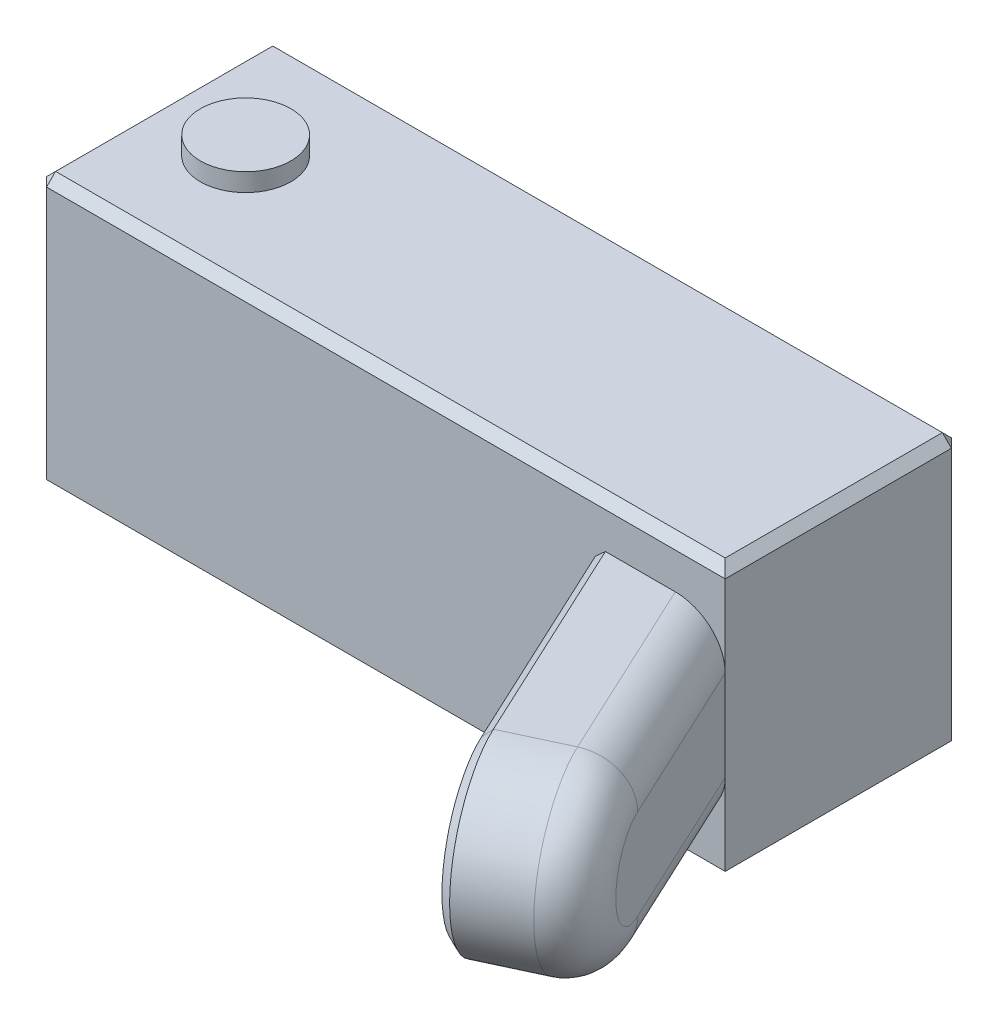
ISO-10303-21;
HEADER;
FILE_DESCRIPTION(('STEP AP214'),'2;1');
FILE_NAME('part.step','',(''),(''),'','','');
FILE_SCHEMA(('AUTOMOTIVE_DESIGN { 1 0 10303 214 1 1 1 1 }'));
ENDSEC;
DATA;
#1=APPLICATION_CONTEXT('core data for automotive mechanical design processes');
#2=APPLICATION_PROTOCOL_DEFINITION('international standard','automotive_design',2000,#1);
#3=PRODUCT_CONTEXT('',#1,'mechanical');
#4=PRODUCT('Part','Part','',(#3));
#5=PRODUCT_RELATED_PRODUCT_CATEGORY('part','',(#4));
#6=PRODUCT_DEFINITION_FORMATION('','',#4);
#7=PRODUCT_DEFINITION_CONTEXT('part definition',#1,'design');
#8=PRODUCT_DEFINITION('design','',#6,#7);
#9=PRODUCT_DEFINITION_SHAPE('','',#8);
#10=(LENGTH_UNIT() NAMED_UNIT(*) SI_UNIT(.MILLI.,.METRE.));
#11=(NAMED_UNIT(*) PLANE_ANGLE_UNIT() SI_UNIT($,.RADIAN.));
#12=(NAMED_UNIT(*) SI_UNIT($,.STERADIAN.) SOLID_ANGLE_UNIT());
#13=UNCERTAINTY_MEASURE_WITH_UNIT(LENGTH_MEASURE(1.E-05),#10,'distance_accuracy_value','');
#14=(GEOMETRIC_REPRESENTATION_CONTEXT(3) GLOBAL_UNCERTAINTY_ASSIGNED_CONTEXT((#13)) GLOBAL_UNIT_ASSIGNED_CONTEXT((#10,
#11,#12)) REPRESENTATION_CONTEXT('',''));
#15=CARTESIAN_POINT('',(0.,0.,0.));
#16=DIRECTION('',(0.,0.,1.));
#17=DIRECTION('',(1.,0.,0.));
#18=AXIS2_PLACEMENT_3D('',#15,#16,#17);
#19=CARTESIAN_POINT('',(38.,-15.,-13.));
#20=DIRECTION('',(1.,0.,0.));
#21=DIRECTION('',(0.,0.,-1.));
#22=AXIS2_PLACEMENT_3D('',#19,#20,#21);
#23=PLANE('',#22);
#24=DIRECTION('',(0.,1.,0.));
#25=VECTOR('',#24,1.);
#26=CARTESIAN_POINT('',(38.,-15.,13.));
#27=LINE('',#26,#25);
#28=CARTESIAN_POINT('',(38.,-14.,13.));
#29=VERTEX_POINT('',#28);
#30=CARTESIAN_POINT('',(38.,-5.,13.));
#31=VERTEX_POINT('',#30);
#32=EDGE_CURVE('E185',#29,#31,#27,.T.);
#33=ORIENTED_EDGE('',*,*,#32,.F.);
#34=DIRECTION('',(0.,0.,-1.));
#35=VECTOR('',#34,1.);
#36=CARTESIAN_POINT('',(38.,-14.,-13.));
#37=LINE('',#36,#35);
#38=CARTESIAN_POINT('',(38.,-14.,-12.));
#39=VERTEX_POINT('',#38);
#40=EDGE_CURVE('E260',#29,#39,#37,.T.);
#41=ORIENTED_EDGE('',*,*,#40,.T.);
#42=DIRECTION('',(0.,1.,0.));
#43=VECTOR('',#42,1.);
#44=CARTESIAN_POINT('',(38.,-15.,-12.));
#45=LINE('',#44,#43);
#46=CARTESIAN_POINT('',(38.,14.,-12.));
#47=VERTEX_POINT('',#46);
#48=EDGE_CURVE('E256',#39,#47,#45,.T.);
#49=ORIENTED_EDGE('',*,*,#48,.T.);
#50=DIRECTION('',(0.,0.,1.));
#51=VECTOR('',#50,1.);
#52=CARTESIAN_POINT('',(38.,14.,-13.));
#53=LINE('',#52,#51);
#54=CARTESIAN_POINT('',(38.,14.,13.));
#55=VERTEX_POINT('',#54);
#56=EDGE_CURVE('E258',#47,#55,#53,.T.);
#57=ORIENTED_EDGE('',*,*,#56,.T.);
#58=CARTESIAN_POINT('',(38.,5.,13.));
#59=VERTEX_POINT('',#58);
#60=EDGE_CURVE('E201',#59,#55,#27,.T.);
#61=ORIENTED_EDGE('',*,*,#60,.F.);
#62=DIRECTION('',(0.,-1.,0.));
#63=VECTOR('',#62,1.);
#64=CARTESIAN_POINT('',(38.,10.,13.));
#65=LINE('',#64,#63);
#66=EDGE_CURVE('E682',#59,#31,#65,.T.);
#67=ORIENTED_EDGE('',*,*,#66,.T.);
#68=EDGE_LOOP('',(#33,#41,#49,#57,#61,#67));
#69=FACE_BOUND('',#68,.T.);
#70=ADVANCED_FACE('F35',(#69),#23,.T.);
#71=CARTESIAN_POINT('',(-38.,-15.,13.));
#72=DIRECTION('',(0.,0.,1.));
#73=DIRECTION('',(1.,0.,0.));
#74=AXIS2_PLACEMENT_3D('',#71,#72,#73);
#75=PLANE('',#74);
#76=DIRECTION('',(0.,-1.,0.));
#77=VECTOR('',#76,1.);
#78=CARTESIAN_POINT('',(-37.,-15.,13.));
#79=LINE('',#78,#77);
#80=CARTESIAN_POINT('',(-37.,14.,13.));
#81=VERTEX_POINT('',#80);
#82=CARTESIAN_POINT('',(-37.,-14.,13.));
#83=VERTEX_POINT('',#82);
#84=EDGE_CURVE('E252',#81,#83,#79,.T.);
#85=ORIENTED_EDGE('',*,*,#84,.T.);
#86=DIRECTION('',(1.,0.,0.));
#87=VECTOR('',#86,1.);
#88=CARTESIAN_POINT('',(38.,-14.,13.));
#89=LINE('',#88,#87);
#90=EDGE_CURVE('E254',#83,#29,#89,.T.);
#91=ORIENTED_EDGE('',*,*,#90,.T.);
#92=ORIENTED_EDGE('',*,*,#32,.T.);
#93=CARTESIAN_POINT('',(32.4831104051875,-5.,13.));
#94=DIRECTION('',(0.,0.,1.));
#95=DIRECTION('',(1.,0.,0.));
#96=AXIS2_PLACEMENT_3D('',#93,#94,#95);
#97=ELLIPSE('',#96,5.51688959481247,5.);
#98=CARTESIAN_POINT('',(32.4831104051875,-10.,13.));
#99=VERTEX_POINT('',#98);
#100=EDGE_CURVE('E181',#31,#99,#97,.F.);
#101=ORIENTED_EDGE('',*,*,#100,.T.);
#102=DIRECTION('',(1.,0.,0.));
#103=VECTOR('',#102,1.);
#104=CARTESIAN_POINT('',(14.466506171018,-10.,13.));
#105=LINE('',#104,#103);
#106=CARTESIAN_POINT('',(24.7594649724501,-10.,13.));
#107=VERTEX_POINT('',#106);
#108=EDGE_CURVE('E167',#107,#99,#105,.T.);
#109=ORIENTED_EDGE('',*,*,#108,.F.);
#110=DIRECTION('',(0.74096564527329,-0.671542934237817,0.));
#111=VECTOR('',#110,1.);
#112=CARTESIAN_POINT('',(12.1420574909731,1.43525465267701,13.));
#113=LINE('',#112,#111);
#114=CARTESIAN_POINT('',(23.6560870534876,-9.,13.));
#115=VERTEX_POINT('',#114);
#116=EDGE_CURVE('E45',#107,#115,#113,.F.);
#117=ORIENTED_EDGE('',*,*,#116,.T.);
#118=DIRECTION('',(0.,-1.,0.));
#119=VECTOR('',#118,1.);
#120=CARTESIAN_POINT('',(23.6560870534876,-10.,13.));
#121=LINE('',#120,#119);
#122=CARTESIAN_POINT('',(23.6560870534876,9.,13.));
#123=VERTEX_POINT('',#122);
#124=EDGE_CURVE('E177',#123,#115,#121,.T.);
#125=ORIENTED_EDGE('',*,*,#124,.F.);
#126=DIRECTION('',(-0.74096564527329,-0.671542934237817,0.));
#127=VECTOR('',#126,1.);
#128=CARTESIAN_POINT('',(13.1372379781656,-0.533314827627534,13.));
#129=LINE('',#128,#127);
#130=CARTESIAN_POINT('',(24.7594649724501,10.,13.));
#131=VERTEX_POINT('',#130);
#132=EDGE_CURVE('E11',#123,#131,#129,.F.);
#133=ORIENTED_EDGE('',*,*,#132,.T.);
#134=DIRECTION('',(-1.,0.,0.));
#135=VECTOR('',#134,1.);
#136=CARTESIAN_POINT('',(2.68450493954154,10.,13.));
#137=LINE('',#136,#135);
#138=CARTESIAN_POINT('',(32.4831104051875,10.,13.));
#139=VERTEX_POINT('',#138);
#140=EDGE_CURVE('E178',#139,#131,#137,.T.);
#141=ORIENTED_EDGE('',*,*,#140,.F.);
#142=CARTESIAN_POINT('',(32.4831104051875,5.,13.));
#143=DIRECTION('',(0.,0.,1.));
#144=DIRECTION('',(-1.,0.,0.));
#145=AXIS2_PLACEMENT_3D('',#142,#143,#144);
#146=ELLIPSE('',#145,5.51688959481247,5.);
#147=EDGE_CURVE('E189',#139,#59,#146,.F.);
#148=ORIENTED_EDGE('',*,*,#147,.T.);
#149=ORIENTED_EDGE('',*,*,#60,.T.);
#150=DIRECTION('',(-1.,0.,0.));
#151=VECTOR('',#150,1.);
#152=CARTESIAN_POINT('',(-38.,14.,13.));
#153=LINE('',#152,#151);
#154=EDGE_CURVE('E250',#55,#81,#153,.T.);
#155=ORIENTED_EDGE('',*,*,#154,.T.);
#156=EDGE_LOOP('',(#85,#91,#92,#101,#109,#117,#125,#133,#141,#148,#149,#155));
#157=FACE_BOUND('',#156,.T.);
#158=ADVANCED_FACE('F182',(#157),#75,.T.);
#159=CARTESIAN_POINT('',(-38.,-15.,-13.));
#160=DIRECTION('',(-1.,0.,0.));
#161=DIRECTION('',(0.,0.,1.));
#162=AXIS2_PLACEMENT_3D('',#159,#160,#161);
#163=PLANE('',#162);
#164=DIRECTION('',(0.,-1.,0.));
#165=VECTOR('',#164,1.);
#166=CARTESIAN_POINT('',(-38.,-15.,-12.));
#167=LINE('',#166,#165);
#168=CARTESIAN_POINT('',(-38.,14.,-12.));
#169=VERTEX_POINT('',#168);
#170=CARTESIAN_POINT('',(-38.,-14.,-12.));
#171=VERTEX_POINT('',#170);
#172=EDGE_CURVE('E266',#169,#171,#167,.T.);
#173=ORIENTED_EDGE('',*,*,#172,.T.);
#174=DIRECTION('',(0.,0.,1.));
#175=VECTOR('',#174,1.);
#176=CARTESIAN_POINT('',(-38.,-14.,13.));
#177=LINE('',#176,#175);
#178=CARTESIAN_POINT('',(-38.,-14.,12.));
#179=VERTEX_POINT('',#178);
#180=EDGE_CURVE('E268',#171,#179,#177,.T.);
#181=ORIENTED_EDGE('',*,*,#180,.T.);
#182=DIRECTION('',(0.,1.,0.));
#183=VECTOR('',#182,1.);
#184=CARTESIAN_POINT('',(-38.,-15.,12.));
#185=LINE('',#184,#183);
#186=CARTESIAN_POINT('',(-38.,14.,12.));
#187=VERTEX_POINT('',#186);
#188=EDGE_CURVE('E264',#179,#187,#185,.T.);
#189=ORIENTED_EDGE('',*,*,#188,.T.);
#190=DIRECTION('',(0.,0.,-1.));
#191=VECTOR('',#190,1.);
#192=CARTESIAN_POINT('',(-38.,14.,-13.));
#193=LINE('',#192,#191);
#194=EDGE_CURVE('E262',#187,#169,#193,.T.);
#195=ORIENTED_EDGE('',*,*,#194,.T.);
#196=EDGE_LOOP('',(#173,#181,#189,#195));
#197=FACE_BOUND('',#196,.T.);
#198=ADVANCED_FACE('F354',(#197),#163,.T.);
#199=CARTESIAN_POINT('',(-38.,-15.,-13.));
#200=DIRECTION('',(0.,0.,-1.));
#201=DIRECTION('',(-1.,0.,0.));
#202=AXIS2_PLACEMENT_3D('',#199,#200,#201);
#203=PLANE('',#202);
#204=DIRECTION('',(0.,-1.,0.));
#205=VECTOR('',#204,1.);
#206=CARTESIAN_POINT('',(37.,-15.,-13.));
#207=LINE('',#206,#205);
#208=CARTESIAN_POINT('',(37.,14.,-13.));
#209=VERTEX_POINT('',#208);
#210=CARTESIAN_POINT('',(37.,-14.,-13.));
#211=VERTEX_POINT('',#210);
#212=EDGE_CURVE('E232',#209,#211,#207,.T.);
#213=ORIENTED_EDGE('',*,*,#212,.T.);
#214=DIRECTION('',(-1.,0.,0.));
#215=VECTOR('',#214,1.);
#216=CARTESIAN_POINT('',(-38.,-14.,-13.));
#217=LINE('',#216,#215);
#218=CARTESIAN_POINT('',(-37.,-14.,-13.));
#219=VERTEX_POINT('',#218);
#220=EDGE_CURVE('E238',#211,#219,#217,.T.);
#221=ORIENTED_EDGE('',*,*,#220,.T.);
#222=DIRECTION('',(0.,1.,0.));
#223=VECTOR('',#222,1.);
#224=CARTESIAN_POINT('',(-37.,-15.,-13.));
#225=LINE('',#224,#223);
#226=CARTESIAN_POINT('',(-37.,14.,-13.));
#227=VERTEX_POINT('',#226);
#228=EDGE_CURVE('E236',#219,#227,#225,.T.);
#229=ORIENTED_EDGE('',*,*,#228,.T.);
#230=DIRECTION('',(1.,0.,0.));
#231=VECTOR('',#230,1.);
#232=CARTESIAN_POINT('',(-38.,14.,-13.));
#233=LINE('',#232,#231);
#234=EDGE_CURVE('E234',#227,#209,#233,.T.);
#235=ORIENTED_EDGE('',*,*,#234,.T.);
#236=EDGE_LOOP('',(#213,#221,#229,#235));
#237=FACE_BOUND('',#236,.T.);
#238=ADVANCED_FACE('F415',(#237),#203,.T.);
#239=CARTESIAN_POINT('',(0.,-15.,0.));
#240=DIRECTION('',(0.,1.,0.));
#241=DIRECTION('',(0.,0.,1.));
#242=AXIS2_PLACEMENT_3D('',#239,#240,#241);
#243=PLANE('',#242);
#244=DIRECTION('',(1.,0.,0.));
#245=VECTOR('',#244,1.);
#246=CARTESIAN_POINT('',(38.,-15.,-12.));
#247=LINE('',#246,#245);
#248=CARTESIAN_POINT('',(-37.,-15.,-12.));
#249=VERTEX_POINT('',#248);
#250=CARTESIAN_POINT('',(37.,-15.,-12.));
#251=VERTEX_POINT('',#250);
#252=EDGE_CURVE('E245',#249,#251,#247,.T.);
#253=ORIENTED_EDGE('',*,*,#252,.T.);
#254=DIRECTION('',(0.,0.,1.));
#255=VECTOR('',#254,1.);
#256=CARTESIAN_POINT('',(37.,-15.,13.));
#257=LINE('',#256,#255);
#258=CARTESIAN_POINT('',(37.,-15.,12.));
#259=VERTEX_POINT('',#258);
#260=EDGE_CURVE('E248',#251,#259,#257,.T.);
#261=ORIENTED_EDGE('',*,*,#260,.T.);
#262=DIRECTION('',(-1.,0.,0.));
#263=VECTOR('',#262,1.);
#264=CARTESIAN_POINT('',(-38.,-15.,12.));
#265=LINE('',#264,#263);
#266=CARTESIAN_POINT('',(-37.,-15.,12.));
#267=VERTEX_POINT('',#266);
#268=EDGE_CURVE('E243',#259,#267,#265,.T.);
#269=ORIENTED_EDGE('',*,*,#268,.T.);
#270=DIRECTION('',(0.,0.,-1.));
#271=VECTOR('',#270,1.);
#272=CARTESIAN_POINT('',(-37.,-15.,-13.));
#273=LINE('',#272,#271);
#274=EDGE_CURVE('E241',#267,#249,#273,.T.);
#275=ORIENTED_EDGE('',*,*,#274,.T.);
#276=EDGE_LOOP('',(#253,#261,#269,#275));
#277=FACE_BOUND('',#276,.T.);
#278=ADVANCED_FACE('F413',(#277),#243,.F.);
#279=CARTESIAN_POINT('',(0.,15.,0.));
#280=DIRECTION('',(0.,1.,0.));
#281=DIRECTION('',(0.,0.,1.));
#282=AXIS2_PLACEMENT_3D('',#279,#280,#281);
#283=PLANE('',#282);
#284=CARTESIAN_POINT('',(-28.,15.,0.));
#285=DIRECTION('',(0.,1.,0.));
#286=DIRECTION('',(0.,0.,1.));
#287=AXIS2_PLACEMENT_3D('',#284,#285,#286);
#288=CIRCLE('',#287,5.);
#289=CARTESIAN_POINT('',(-28.,15.,5.));
#290=VERTEX_POINT('',#289);
#291=EDGE_CURVE('E674',#290,#290,#288,.T.);
#292=ORIENTED_EDGE('',*,*,#291,.F.);
#293=EDGE_LOOP('',(#292));
#294=FACE_BOUND('',#293,.T.);
#295=DIRECTION('',(0.,0.,1.));
#296=VECTOR('',#295,1.);
#297=CARTESIAN_POINT('',(-37.,15.,0.));
#298=LINE('',#297,#296);
#299=CARTESIAN_POINT('',(-37.,15.,-12.));
#300=VERTEX_POINT('',#299);
#301=CARTESIAN_POINT('',(-37.,15.,12.));
#302=VERTEX_POINT('',#301);
#303=EDGE_CURVE('E53',#300,#302,#298,.T.);
#304=ORIENTED_EDGE('',*,*,#303,.T.);
#305=DIRECTION('',(1.,0.,0.));
#306=VECTOR('',#305,1.);
#307=CARTESIAN_POINT('',(0.,15.,12.));
#308=LINE('',#307,#306);
#309=CARTESIAN_POINT('',(37.,15.,12.));
#310=VERTEX_POINT('',#309);
#311=EDGE_CURVE('E275',#302,#310,#308,.T.);
#312=ORIENTED_EDGE('',*,*,#311,.T.);
#313=DIRECTION('',(0.,0.,-1.));
#314=VECTOR('',#313,1.);
#315=CARTESIAN_POINT('',(37.,15.,0.));
#316=LINE('',#315,#314);
#317=CARTESIAN_POINT('',(37.,15.,-12.));
#318=VERTEX_POINT('',#317);
#319=EDGE_CURVE('E271',#310,#318,#316,.T.);
#320=ORIENTED_EDGE('',*,*,#319,.T.);
#321=DIRECTION('',(-1.,0.,0.));
#322=VECTOR('',#321,1.);
#323=CARTESIAN_POINT('',(0.,15.,-12.));
#324=LINE('',#323,#322);
#325=EDGE_CURVE('E58',#318,#300,#324,.T.);
#326=ORIENTED_EDGE('',*,*,#325,.T.);
#327=EDGE_LOOP('',(#304,#312,#320,#326));
#328=FACE_BOUND('',#327,.T.);
#329=ADVANCED_FACE('F391',(#294,#328),#283,.T.);
#330=CARTESIAN_POINT('',(14.466506171018,-10.,-37.4677403800204));
#331=DIRECTION('',(0.,1.,0.));
#332=DIRECTION('',(0.,0.,1.));
#333=AXIS2_PLACEMENT_3D('',#330,#331,#332);
#334=PLANE('',#333);
#335=DIRECTION('',(0.906307787036648,0.,-0.422618261740703));
#336=VECTOR('',#335,1.);
#337=CARTESIAN_POINT('',(34.6703640033377,-10.0000000000001,36.6201931433622));
#338=LINE('',#337,#336);
#339=CARTESIAN_POINT('',(35.5766717903743,-10.0000000000001,36.1975748816215));
#340=VERTEX_POINT('',#339);
#341=CARTESIAN_POINT('',(41.9208262996309,-10.0000000000001,33.2392470494366));
#342=VERTEX_POINT('',#341);
#343=EDGE_CURVE('E680',#340,#342,#338,.T.);
#344=ORIENTED_EDGE('',*,*,#343,.F.);
#345=DIRECTION('',(-0.422618261740703,0.,-0.906307787036648));
#346=VECTOR('',#345,1.);
#347=CARTESIAN_POINT('',(3.5908127265782,-10.,-32.3963212391319));
#348=LINE('',#347,#346);
#349=EDGE_CURVE('E174',#340,#107,#348,.T.);
#350=ORIENTED_EDGE('',*,*,#349,.T.);
#351=ORIENTED_EDGE('',*,*,#108,.T.);
#352=DIRECTION('',(0.422618261740703,0.,0.906307787036648));
#353=VECTOR('',#352,1.);
#354=CARTESIAN_POINT('',(9.93496723583475,-10.,-35.3546490713169));
#355=LINE('',#354,#353);
#356=EDGE_CURVE('E172',#99,#342,#355,.T.);
#357=ORIENTED_EDGE('',*,*,#356,.T.);
#358=EDGE_LOOP('',(#344,#350,#351,#357));
#359=FACE_BOUND('',#358,.T.);
#360=ADVANCED_FACE('F170',(#359),#334,.F.);
#361=CARTESIAN_POINT('',(2.68450493954154,-10.,-31.9737029773912));
#362=DIRECTION('',(0.906307787036648,0.,-0.422618261740703));
#363=DIRECTION('',(-0.422618261740703,0.,-0.906307787036648));
#364=AXIS2_PLACEMENT_3D('',#361,#362,#363);
#365=PLANE('',#364);
#366=ORIENTED_EDGE('',*,*,#124,.T.);
#367=DIRECTION('',(0.422618261740703,0.,0.906307787036648));
#368=VECTOR('',#367,1.);
#369=CARTESIAN_POINT('',(2.68450493954154,-9.,-31.9737029773912));
#370=LINE('',#369,#368);
#371=CARTESIAN_POINT('',(34.6703640033377,-9.00000000000012,36.6201931433622));
#372=VERTEX_POINT('',#371);
#373=EDGE_CURVE('E224',#115,#372,#370,.T.);
#374=ORIENTED_EDGE('',*,*,#373,.T.);
#375=CARTESIAN_POINT('',(34.6703640033377,-1.17306473400783E-13,36.6201931433622));
#376=DIRECTION('',(0.906307787036648,0.,-0.422618261740703));
#377=DIRECTION('',(-0.422618261740703,0.,-0.906307787036648));
#378=AXIS2_PLACEMENT_3D('',#375,#376,#377);
#379=CIRCLE('',#378,9.);
#380=CARTESIAN_POINT('',(34.6703640033377,9.,36.6201931433622));
#381=VERTEX_POINT('',#380);
#382=EDGE_CURVE('E222',#372,#381,#379,.F.);
#383=ORIENTED_EDGE('',*,*,#382,.T.);
#384=DIRECTION('',(-0.422618261740703,0.,-0.906307787036648));
#385=VECTOR('',#384,1.);
#386=CARTESIAN_POINT('',(2.68450493954154,9.,-31.9737029773912));
#387=LINE('',#386,#385);
#388=EDGE_CURVE('E214',#381,#123,#387,.T.);
#389=ORIENTED_EDGE('',*,*,#388,.T.);
#390=EDGE_LOOP('',(#366,#374,#383,#389));
#391=FACE_BOUND('',#390,.T.);
#392=ADVANCED_FACE('F600',(#391),#365,.F.);
#393=CARTESIAN_POINT('',(2.68450493954154,10.,-31.9737029773912));
#394=DIRECTION('',(0.,-1.,0.));
#395=DIRECTION('',(0.,0.,-1.));
#396=AXIS2_PLACEMENT_3D('',#393,#394,#395);
#397=PLANE('',#396);
#398=ORIENTED_EDGE('',*,*,#140,.T.);
#399=DIRECTION('',(0.422618261740703,0.,0.906307787036648));
#400=VECTOR('',#399,1.);
#401=CARTESIAN_POINT('',(3.59081272657819,10.,-32.3963212391319));
#402=LINE('',#401,#400);
#403=CARTESIAN_POINT('',(35.5766717903743,10.,36.1975748816215));
#404=VERTEX_POINT('',#403);
#405=EDGE_CURVE('E230',#131,#404,#402,.T.);
#406=ORIENTED_EDGE('',*,*,#405,.T.);
#407=DIRECTION('',(0.906307787036648,0.,-0.422618261740703));
#408=VECTOR('',#407,1.);
#409=CARTESIAN_POINT('',(34.6703640033377,10.,36.6201931433622));
#410=LINE('',#409,#408);
#411=CARTESIAN_POINT('',(41.9208262996309,10.,33.2392470494366));
#412=VERTEX_POINT('',#411);
#413=EDGE_CURVE('E220',#404,#412,#410,.T.);
#414=ORIENTED_EDGE('',*,*,#413,.T.);
#415=DIRECTION('',(-0.422618261740703,0.,-0.906307787036648));
#416=VECTOR('',#415,1.);
#417=CARTESIAN_POINT('',(9.93496723583475,10.,-35.3546490713169));
#418=LINE('',#417,#416);
#419=EDGE_CURVE('E208',#412,#139,#418,.T.);
#420=ORIENTED_EDGE('',*,*,#419,.T.);
#421=EDGE_LOOP('',(#398,#406,#414,#420));
#422=FACE_BOUND('',#421,.T.);
#423=ADVANCED_FACE('F424',(#422),#397,.F.);
#424=CARTESIAN_POINT('',(34.6703640033377,-1.17306473400783E-13,36.6201931433622));
#425=DIRECTION('',(0.906307787036648,0.,-0.422618261740703));
#426=DIRECTION('',(-0.422618261740703,0.,-0.906307787036648));
#427=AXIS2_PLACEMENT_3D('',#424,#425,#426);
#428=CYLINDRICAL_SURFACE('',#427,10.);
#429=ORIENTED_EDGE('',*,*,#413,.F.);
#430=CARTESIAN_POINT('',(35.5766717903743,-1.17306473400783E-13,36.1975748816215));
#431=DIRECTION('',(0.906307787036648,0.,-0.422618261740703));
#432=DIRECTION('',(-0.422618261740703,0.,-0.906307787036648));
#433=AXIS2_PLACEMENT_3D('',#430,#431,#432);
#434=CIRCLE('',#433,10.);
#435=EDGE_CURVE('E228',#404,#340,#434,.T.);
#436=ORIENTED_EDGE('',*,*,#435,.T.);
#437=ORIENTED_EDGE('',*,*,#343,.T.);
#438=CARTESIAN_POINT('',(41.9208262996309,-1.17306473400783E-13,33.2392470494366));
#439=DIRECTION('',(-0.906307787036648,0.,0.422618261740703));
#440=DIRECTION('',(0.422618261740703,0.,0.906307787036648));
#441=AXIS2_PLACEMENT_3D('',#438,#439,#440);
#442=CIRCLE('',#441,10.);
#443=EDGE_CURVE('E190',#342,#412,#442,.T.);
#444=ORIENTED_EDGE('',*,*,#443,.T.);
#445=EDGE_LOOP('',(#429,#436,#437,#444));
#446=FACE_BOUND('',#445,.T.);
#447=ADVANCED_FACE('F586',(#446),#428,.T.);
#448=CARTESIAN_POINT('',(46.4523652348141,-1.17306473400783E-13,31.1261557407331));
#449=DIRECTION('',(-0.906307787036648,0.,0.422618261740703));
#450=DIRECTION('',(0.422618261740703,0.,0.906307787036648));
#451=AXIS2_PLACEMENT_3D('',#448,#449,#450);
#452=PLANE('',#451);
#453=CARTESIAN_POINT('',(46.4523652348141,-1.17306473400783E-13,31.1261557407331));
#454=DIRECTION('',(-0.906307787036648,0.,0.422618261740703));
#455=DIRECTION('',(0.422618261740703,0.,0.906307787036648));
#456=AXIS2_PLACEMENT_3D('',#453,#454,#455);
#457=CIRCLE('',#456,5.);
#458=CARTESIAN_POINT('',(46.4523652348141,4.99999999999988,31.1261557407331));
#459=VERTEX_POINT('',#458);
#460=CARTESIAN_POINT('',(46.4523652348141,-5.00000000000012,31.1261557407331));
#461=VERTEX_POINT('',#460);
#462=EDGE_CURVE('E197',#459,#461,#457,.F.);
#463=ORIENTED_EDGE('',*,*,#462,.T.);
#464=DIRECTION('',(0.422618261740703,0.,0.906307787036648));
#465=VECTOR('',#464,1.);
#466=CARTESIAN_POINT('',(46.4523652348141,-5.,31.1261557407331));
#467=LINE('',#466,#465);
#468=EDGE_CURVE('E206',#461,#31,#467,.F.);
#469=ORIENTED_EDGE('',*,*,#468,.T.);
#470=ORIENTED_EDGE('',*,*,#66,.F.);
#471=DIRECTION('',(-0.422618261740703,0.,-0.906307787036648));
#472=VECTOR('',#471,1.);
#473=CARTESIAN_POINT('',(46.4523652348141,5.,31.1261557407331));
#474=LINE('',#473,#472);
#475=EDGE_CURVE('E199',#59,#459,#474,.F.);
#476=ORIENTED_EDGE('',*,*,#475,.T.);
#477=EDGE_LOOP('',(#463,#469,#470,#476));
#478=FACE_BOUND('',#477,.T.);
#479=ADVANCED_FACE('F446',(#478),#452,.F.);
#480=CARTESIAN_POINT('',(9.93496723583475,5.,-35.3546490713169));
#481=DIRECTION('',(-0.422618261740703,0.,-0.906307787036648));
#482=DIRECTION('',(-0.906307787036648,0.,0.422618261740703));
#483=AXIS2_PLACEMENT_3D('',#480,#481,#482);
#484=CYLINDRICAL_SURFACE('',#483,5.);
#485=ORIENTED_EDGE('',*,*,#147,.F.);
#486=ORIENTED_EDGE('',*,*,#419,.F.);
#487=CARTESIAN_POINT('',(41.9208262996309,5.,33.2392470494366));
#488=DIRECTION('',(0.422618261740703,0.,0.906307787036648));
#489=DIRECTION('',(0.906307787036648,0.,-0.422618261740703));
#490=AXIS2_PLACEMENT_3D('',#487,#488,#489);
#491=CIRCLE('',#490,5.);
#492=EDGE_CURVE('E216',#459,#412,#491,.T.);
#493=ORIENTED_EDGE('',*,*,#492,.F.);
#494=ORIENTED_EDGE('',*,*,#475,.F.);
#495=EDGE_LOOP('',(#485,#486,#493,#494));
#496=FACE_BOUND('',#495,.T.);
#497=ADVANCED_FACE('F442',(#496),#484,.T.);
#498=CARTESIAN_POINT('',(41.9208262996309,-1.17306473400783E-13,33.2392470494366));
#499=DIRECTION('',(-0.906307787036648,0.,0.422618261740703));
#500=DIRECTION('',(0.422618261740703,0.,0.906307787036648));
#501=AXIS2_PLACEMENT_3D('',#498,#499,#500);
#502=DEGENERATE_TOROIDAL_SURFACE('',#501,5.,5.,.T.);
#503=ORIENTED_EDGE('',*,*,#492,.T.);
#504=ORIENTED_EDGE('',*,*,#443,.F.);
#505=CARTESIAN_POINT('',(41.9208262996309,-5.00000000000012,33.2392470494366));
#506=DIRECTION('',(-0.422618261740703,0.,-0.906307787036648));
#507=DIRECTION('',(-0.906307787036648,0.,0.422618261740703));
#508=AXIS2_PLACEMENT_3D('',#505,#506,#507);
#509=CIRCLE('',#508,5.);
#510=EDGE_CURVE('E195',#461,#342,#509,.T.);
#511=ORIENTED_EDGE('',*,*,#510,.F.);
#512=ORIENTED_EDGE('',*,*,#462,.F.);
#513=EDGE_LOOP('',(#503,#504,#511,#512));
#514=FACE_BOUND('',#513,.T.);
#515=ADVANCED_FACE('F439',(#514),#502,.T.);
#516=CARTESIAN_POINT('',(9.93496723583475,-5.,-35.3546490713169));
#517=DIRECTION('',(0.422618261740703,0.,0.906307787036648));
#518=DIRECTION('',(0.906307787036648,0.,-0.422618261740703));
#519=AXIS2_PLACEMENT_3D('',#516,#517,#518);
#520=CYLINDRICAL_SURFACE('',#519,5.);
#521=ORIENTED_EDGE('',*,*,#100,.F.);
#522=ORIENTED_EDGE('',*,*,#468,.F.);
#523=ORIENTED_EDGE('',*,*,#510,.T.);
#524=ORIENTED_EDGE('',*,*,#356,.F.);
#525=EDGE_LOOP('',(#521,#522,#523,#524));
#526=FACE_BOUND('',#525,.T.);
#527=ADVANCED_FACE('F193',(#526),#520,.T.);
#528=CARTESIAN_POINT('',(3.59081272657819,10.,-32.3963212391319));
#529=DIRECTION('',(0.640856382055787,-0.707106781186548,-0.298836238730122));
#530=DIRECTION('',(0.422618261740703,0.,0.906307787036648));
#531=AXIS2_PLACEMENT_3D('',#528,#529,#530);
#532=PLANE('',#531);
#533=ORIENTED_EDGE('',*,*,#132,.F.);
#534=ORIENTED_EDGE('',*,*,#388,.F.);
#535=DIRECTION('',(-0.640856382055789,-0.707106781186546,0.298836238730123));
#536=VECTOR('',#535,1.);
#537=CARTESIAN_POINT('',(35.5766717903743,10.,36.1975748816215));
#538=LINE('',#537,#536);
#539=EDGE_CURVE('E217',#404,#381,#538,.T.);
#540=ORIENTED_EDGE('',*,*,#539,.F.);
#541=ORIENTED_EDGE('',*,*,#405,.F.);
#542=EDGE_LOOP('',(#533,#534,#540,#541));
#543=FACE_BOUND('',#542,.T.);
#544=ADVANCED_FACE('F438',(#543),#532,.F.);
#545=CARTESIAN_POINT('',(34.6703640033377,-1.17306473400783E-13,36.6201931433622));
#546=DIRECTION('',(0.906307787036648,0.,-0.422618261740703));
#547=DIRECTION('',(-0.422618261740703,0.,-0.906307787036648));
#548=AXIS2_PLACEMENT_3D('',#545,#546,#547);
#549=CONICAL_SURFACE('',#548,9.,0.785398163397446);
#550=ORIENTED_EDGE('',*,*,#539,.T.);
#551=ORIENTED_EDGE('',*,*,#382,.F.);
#552=DIRECTION('',(-0.640856382055789,0.707106781186546,0.298836238730123));
#553=VECTOR('',#552,1.);
#554=CARTESIAN_POINT('',(35.5766717903743,-10.0000000000001,36.1975748816215));
#555=LINE('',#554,#553);
#556=EDGE_CURVE('E278',#340,#372,#555,.T.);
#557=ORIENTED_EDGE('',*,*,#556,.F.);
#558=ORIENTED_EDGE('',*,*,#435,.F.);
#559=EDGE_LOOP('',(#550,#551,#557,#558));
#560=FACE_BOUND('',#559,.T.);
#561=ADVANCED_FACE('F455',(#560),#549,.T.);
#562=CARTESIAN_POINT('',(2.68450493954154,-9.,-31.9737029773912));
#563=DIRECTION('',(0.640856382055787,0.707106781186548,-0.298836238730122));
#564=DIRECTION('',(0.422618261740703,0.,0.906307787036648));
#565=AXIS2_PLACEMENT_3D('',#562,#563,#564);
#566=PLANE('',#565);
#567=ORIENTED_EDGE('',*,*,#116,.F.);
#568=ORIENTED_EDGE('',*,*,#349,.F.);
#569=ORIENTED_EDGE('',*,*,#556,.T.);
#570=ORIENTED_EDGE('',*,*,#373,.F.);
#571=EDGE_LOOP('',(#567,#568,#569,#570));
#572=FACE_BOUND('',#571,.T.);
#573=ADVANCED_FACE('F449',(#572),#566,.F.);
#574=CARTESIAN_POINT('',(0.,15.,12.));
#575=DIRECTION('',(0.,-0.707106781186552,-0.707106781186543));
#576=DIRECTION('',(1.,0.,0.));
#577=AXIS2_PLACEMENT_3D('',#574,#575,#576);
#578=PLANE('',#577);
#579=DIRECTION('',(0.,-0.707106781186543,0.707106781186552));
#580=VECTOR('',#579,1.);
#581=CARTESIAN_POINT('',(-37.,14.5,12.5));
#582=LINE('',#581,#580);
#583=EDGE_CURVE('E40',#81,#302,#582,.F.);
#584=ORIENTED_EDGE('',*,*,#583,.F.);
#585=ORIENTED_EDGE('',*,*,#154,.F.);
#586=DIRECTION('',(0.577350269189618,-0.577350269189626,0.577350269189634));
#587=VECTOR('',#586,1.);
#588=CARTESIAN_POINT('',(33.,19.0000000000001,7.99999999999989));
#589=LINE('',#588,#587);
#590=EDGE_CURVE('E333',#310,#55,#589,.T.);
#591=ORIENTED_EDGE('',*,*,#590,.F.);
#592=ORIENTED_EDGE('',*,*,#311,.F.);
#593=EDGE_LOOP('',(#584,#585,#591,#592));
#594=FACE_BOUND('',#593,.T.);
#595=ADVANCED_FACE('F38',(#594),#578,.F.);
#596=CARTESIAN_POINT('',(-38.,14.,12.));
#597=DIRECTION('',(-0.577350269189626,0.577350269189634,0.577350269189618));
#598=DIRECTION('',(-0.707106781186552,-0.707106781186543,0.));
#599=AXIS2_PLACEMENT_3D('',#596,#597,#598);
#600=PLANE('',#599);
#601=DIRECTION('',(-0.707106781186543,0.,-0.707106781186552));
#602=VECTOR('',#601,1.);
#603=CARTESIAN_POINT('',(-38.,14.,12.));
#604=LINE('',#603,#602);
#605=EDGE_CURVE('E328',#81,#187,#604,.T.);
#606=ORIENTED_EDGE('',*,*,#605,.F.);
#607=ORIENTED_EDGE('',*,*,#583,.T.);
#608=DIRECTION('',(0.707106781186552,0.707106781186543,0.));
#609=VECTOR('',#608,1.);
#610=CARTESIAN_POINT('',(-38.,14.,12.));
#611=LINE('',#610,#609);
#612=EDGE_CURVE('E331',#187,#302,#611,.T.);
#613=ORIENTED_EDGE('',*,*,#612,.F.);
#614=EDGE_LOOP('',(#606,#607,#613));
#615=FACE_BOUND('',#614,.T.);
#616=ADVANCED_FACE('F343',(#615),#600,.T.);
#617=CARTESIAN_POINT('',(37.,15.,0.));
#618=DIRECTION('',(-0.707106781186552,-0.707106781186543,0.));
#619=DIRECTION('',(0.,0.,-1.));
#620=AXIS2_PLACEMENT_3D('',#617,#618,#619);
#621=PLANE('',#620);
#622=ORIENTED_EDGE('',*,*,#590,.T.);
#623=ORIENTED_EDGE('',*,*,#56,.F.);
#624=DIRECTION('',(-0.707106781186543,0.707106781186552,0.));
#625=VECTOR('',#624,1.);
#626=CARTESIAN_POINT('',(37.5,14.5,-12.));
#627=LINE('',#626,#625);
#628=EDGE_CURVE('E325',#318,#47,#627,.F.);
#629=ORIENTED_EDGE('',*,*,#628,.F.);
#630=ORIENTED_EDGE('',*,*,#319,.F.);
#631=EDGE_LOOP('',(#622,#623,#629,#630));
#632=FACE_BOUND('',#631,.T.);
#633=ADVANCED_FACE('F386',(#632),#621,.F.);
#634=CARTESIAN_POINT('',(0.,15.,-12.));
#635=DIRECTION('',(0.,-0.707106781186552,0.707106781186543));
#636=DIRECTION('',(-1.,0.,0.));
#637=AXIS2_PLACEMENT_3D('',#634,#635,#636);
#638=PLANE('',#637);
#639=DIRECTION('',(0.,0.707106781186543,0.707106781186552));
#640=VECTOR('',#639,1.);
#641=CARTESIAN_POINT('',(-37.,14.,-13.));
#642=LINE('',#641,#640);
#643=EDGE_CURVE('E319',#300,#227,#642,.F.);
#644=ORIENTED_EDGE('',*,*,#643,.F.);
#645=ORIENTED_EDGE('',*,*,#325,.F.);
#646=DIRECTION('',(0.,-0.707106781186543,-0.707106781186552));
#647=VECTOR('',#646,1.);
#648=CARTESIAN_POINT('',(37.,14.,-13.));
#649=LINE('',#648,#647);
#650=EDGE_CURVE('E322',#209,#318,#649,.F.);
#651=ORIENTED_EDGE('',*,*,#650,.F.);
#652=ORIENTED_EDGE('',*,*,#234,.F.);
#653=EDGE_LOOP('',(#644,#645,#651,#652));
#654=FACE_BOUND('',#653,.T.);
#655=ADVANCED_FACE('F393',(#654),#638,.F.);
#656=CARTESIAN_POINT('',(-37.,15.,0.));
#657=DIRECTION('',(0.707106781186543,-0.707106781186552,0.));
#658=DIRECTION('',(0.,0.,1.));
#659=AXIS2_PLACEMENT_3D('',#656,#657,#658);
#660=PLANE('',#659);
#661=ORIENTED_EDGE('',*,*,#612,.T.);
#662=ORIENTED_EDGE('',*,*,#303,.F.);
#663=DIRECTION('',(-0.707106781186552,-0.707106781186543,0.));
#664=VECTOR('',#663,1.);
#665=CARTESIAN_POINT('',(-37.5,14.5,-12.));
#666=LINE('',#665,#664);
#667=EDGE_CURVE('E316',#169,#300,#666,.F.);
#668=ORIENTED_EDGE('',*,*,#667,.F.);
#669=ORIENTED_EDGE('',*,*,#194,.F.);
#670=EDGE_LOOP('',(#661,#662,#668,#669));
#671=FACE_BOUND('',#670,.T.);
#672=ADVANCED_FACE('F349',(#671),#660,.F.);
#673=CARTESIAN_POINT('',(-38.,-15.,12.));
#674=DIRECTION('',(0.707106781186552,0.,-0.707106781186543));
#675=DIRECTION('',(0.,1.,0.));
#676=AXIS2_PLACEMENT_3D('',#673,#674,#675);
#677=PLANE('',#676);
#678=ORIENTED_EDGE('',*,*,#605,.T.);
#679=ORIENTED_EDGE('',*,*,#188,.F.);
#680=DIRECTION('',(0.707106781186543,0.,0.707106781186552));
#681=VECTOR('',#680,1.);
#682=CARTESIAN_POINT('',(-37.5,-14.,12.5));
#683=LINE('',#682,#681);
#684=EDGE_CURVE('E313',#83,#179,#683,.F.);
#685=ORIENTED_EDGE('',*,*,#684,.F.);
#686=ORIENTED_EDGE('',*,*,#84,.F.);
#687=EDGE_LOOP('',(#678,#679,#685,#686));
#688=FACE_BOUND('',#687,.T.);
#689=ADVANCED_FACE('F360',(#688),#677,.F.);
#690=CARTESIAN_POINT('',(-38.,-14.,13.));
#691=DIRECTION('',(0.,-0.707106781186543,0.707106781186552));
#692=DIRECTION('',(-1.,0.,0.));
#693=AXIS2_PLACEMENT_3D('',#690,#691,#692);
#694=PLANE('',#693);
#695=DIRECTION('',(-0.577350269189623,-0.577350269189631,-0.577350269189623));
#696=VECTOR('',#695,1.);
#697=CARTESIAN_POINT('',(29.3333333333334,-22.6666666666667,4.33333333333341));
#698=LINE('',#697,#696);
#699=EDGE_CURVE('E307',#29,#259,#698,.T.);
#700=ORIENTED_EDGE('',*,*,#699,.F.);
#701=ORIENTED_EDGE('',*,*,#90,.F.);
#702=DIRECTION('',(0.,0.707106781186552,0.707106781186543));
#703=VECTOR('',#702,1.);
#704=CARTESIAN_POINT('',(-37.,-15.,12.));
#705=LINE('',#704,#703);
#706=EDGE_CURVE('E310',#267,#83,#705,.T.);
#707=ORIENTED_EDGE('',*,*,#706,.F.);
#708=ORIENTED_EDGE('',*,*,#268,.F.);
#709=EDGE_LOOP('',(#700,#701,#707,#708));
#710=FACE_BOUND('',#709,.T.);
#711=ADVANCED_FACE('F366',(#710),#694,.T.);
#712=CARTESIAN_POINT('',(37.,14.,-13.));
#713=DIRECTION('',(0.577350269189633,0.577350269189624,-0.57735026918962));
#714=DIRECTION('',(-0.707106781186542,0.707106781186552,0.));
#715=AXIS2_PLACEMENT_3D('',#712,#713,#714);
#716=PLANE('',#715);
#717=ORIENTED_EDGE('',*,*,#650,.T.);
#718=ORIENTED_EDGE('',*,*,#628,.T.);
#719=DIRECTION('',(0.707106781186545,0.,0.70710678118655));
#720=VECTOR('',#719,1.);
#721=CARTESIAN_POINT('',(37.,14.,-13.));
#722=LINE('',#721,#720);
#723=EDGE_CURVE('E304',#209,#47,#722,.T.);
#724=ORIENTED_EDGE('',*,*,#723,.F.);
#725=EDGE_LOOP('',(#717,#718,#724));
#726=FACE_BOUND('',#725,.T.);
#727=ADVANCED_FACE('F383',(#726),#716,.T.);
#728=CARTESIAN_POINT('',(-37.,14.,-13.));
#729=DIRECTION('',(-0.577350269189626,0.577350269189634,-0.577350269189618));
#730=DIRECTION('',(-0.707106781186552,-0.707106781186543,0.));
#731=AXIS2_PLACEMENT_3D('',#728,#729,#730);
#732=PLANE('',#731);
#733=ORIENTED_EDGE('',*,*,#667,.T.);
#734=ORIENTED_EDGE('',*,*,#643,.T.);
#735=DIRECTION('',(0.707106781186543,0.,-0.707106781186552));
#736=VECTOR('',#735,1.);
#737=CARTESIAN_POINT('',(-37.,14.,-13.));
#738=LINE('',#737,#736);
#739=EDGE_CURVE('E301',#169,#227,#738,.T.);
#740=ORIENTED_EDGE('',*,*,#739,.F.);
#741=EDGE_LOOP('',(#733,#734,#740));
#742=FACE_BOUND('',#741,.T.);
#743=ADVANCED_FACE('F396',(#742),#732,.T.);
#744=CARTESIAN_POINT('',(-37.,-15.,12.));
#745=DIRECTION('',(-0.577350269189634,-0.577350269189618,0.577350269189626));
#746=DIRECTION('',(0.707106781186543,0.,0.707106781186552));
#747=AXIS2_PLACEMENT_3D('',#744,#745,#746);
#748=PLANE('',#747);
#749=ORIENTED_EDGE('',*,*,#706,.T.);
#750=ORIENTED_EDGE('',*,*,#684,.T.);
#751=DIRECTION('',(0.707106781186543,-0.707106781186552,0.));
#752=VECTOR('',#751,1.);
#753=CARTESIAN_POINT('',(-37.,-15.,12.));
#754=LINE('',#753,#752);
#755=EDGE_CURVE('E299',#267,#179,#754,.F.);
#756=ORIENTED_EDGE('',*,*,#755,.F.);
#757=EDGE_LOOP('',(#749,#750,#756));
#758=FACE_BOUND('',#757,.T.);
#759=ADVANCED_FACE('F507',(#758),#748,.T.);
#760=CARTESIAN_POINT('',(38.,-14.,-13.));
#761=DIRECTION('',(0.707106781186552,-0.707106781186543,0.));
#762=DIRECTION('',(0.,0.,1.));
#763=AXIS2_PLACEMENT_3D('',#760,#761,#762);
#764=PLANE('',#763);
#765=ORIENTED_EDGE('',*,*,#699,.T.);
#766=ORIENTED_EDGE('',*,*,#260,.F.);
#767=DIRECTION('',(-0.707106781186543,-0.707106781186552,0.));
#768=VECTOR('',#767,1.);
#769=CARTESIAN_POINT('',(37.,-15.,-12.));
#770=LINE('',#769,#768);
#771=EDGE_CURVE('E296',#39,#251,#770,.T.);
#772=ORIENTED_EDGE('',*,*,#771,.F.);
#773=ORIENTED_EDGE('',*,*,#40,.F.);
#774=EDGE_LOOP('',(#765,#766,#772,#773));
#775=FACE_BOUND('',#774,.T.);
#776=ADVANCED_FACE('F371',(#775),#764,.T.);
#777=CARTESIAN_POINT('',(38.,-15.,-12.));
#778=DIRECTION('',(-0.70710678118655,0.,0.707106781186545));
#779=DIRECTION('',(0.,1.,0.));
#780=AXIS2_PLACEMENT_3D('',#777,#778,#779);
#781=PLANE('',#780);
#782=ORIENTED_EDGE('',*,*,#723,.T.);
#783=ORIENTED_EDGE('',*,*,#48,.F.);
#784=DIRECTION('',(-0.707106781186545,0.,-0.70710678118655));
#785=VECTOR('',#784,1.);
#786=CARTESIAN_POINT('',(37.5,-14.,-12.5));
#787=LINE('',#786,#785);
#788=EDGE_CURVE('E293',#211,#39,#787,.F.);
#789=ORIENTED_EDGE('',*,*,#788,.F.);
#790=ORIENTED_EDGE('',*,*,#212,.F.);
#791=EDGE_LOOP('',(#782,#783,#789,#790));
#792=FACE_BOUND('',#791,.T.);
#793=ADVANCED_FACE('F378',(#792),#781,.F.);
#794=CARTESIAN_POINT('',(-37.,-15.,-13.));
#795=DIRECTION('',(0.707106781186552,0.,0.707106781186543));
#796=DIRECTION('',(0.,1.,0.));
#797=AXIS2_PLACEMENT_3D('',#794,#795,#796);
#798=PLANE('',#797);
#799=ORIENTED_EDGE('',*,*,#739,.T.);
#800=ORIENTED_EDGE('',*,*,#228,.F.);
#801=DIRECTION('',(-0.707106781186543,0.,0.707106781186552));
#802=VECTOR('',#801,1.);
#803=CARTESIAN_POINT('',(-37.,-14.,-13.));
#804=LINE('',#803,#802);
#805=EDGE_CURVE('E290',#171,#219,#804,.F.);
#806=ORIENTED_EDGE('',*,*,#805,.F.);
#807=ORIENTED_EDGE('',*,*,#172,.F.);
#808=EDGE_LOOP('',(#799,#800,#806,#807));
#809=FACE_BOUND('',#808,.T.);
#810=ADVANCED_FACE('F400',(#809),#798,.F.);
#811=CARTESIAN_POINT('',(-38.,-14.,-13.));
#812=DIRECTION('',(-0.707106781186552,-0.707106781186543,0.));
#813=DIRECTION('',(0.,0.,-1.));
#814=AXIS2_PLACEMENT_3D('',#811,#812,#813);
#815=PLANE('',#814);
#816=ORIENTED_EDGE('',*,*,#755,.T.);
#817=ORIENTED_EDGE('',*,*,#180,.F.);
#818=DIRECTION('',(-0.707106781186543,0.707106781186552,0.));
#819=VECTOR('',#818,1.);
#820=CARTESIAN_POINT('',(-37.5,-14.5,-12.));
#821=LINE('',#820,#819);
#822=EDGE_CURVE('E287',#249,#171,#821,.T.);
#823=ORIENTED_EDGE('',*,*,#822,.F.);
#824=ORIENTED_EDGE('',*,*,#274,.F.);
#825=EDGE_LOOP('',(#816,#817,#823,#824));
#826=FACE_BOUND('',#825,.T.);
#827=ADVANCED_FACE('F408',(#826),#815,.T.);
#828=CARTESIAN_POINT('',(37.,-15.,-12.));
#829=DIRECTION('',(0.577350269189633,-0.577350269189624,-0.577350269189621));
#830=DIRECTION('',(0.707106781186542,0.707106781186552,0.));
#831=AXIS2_PLACEMENT_3D('',#828,#829,#830);
#832=PLANE('',#831);
#833=ORIENTED_EDGE('',*,*,#788,.T.);
#834=ORIENTED_EDGE('',*,*,#771,.T.);
#835=DIRECTION('',(0.,0.707106781186543,-0.707106781186552));
#836=VECTOR('',#835,1.);
#837=CARTESIAN_POINT('',(37.,-15.,-12.));
#838=LINE('',#837,#836);
#839=EDGE_CURVE('E284',#211,#251,#838,.F.);
#840=ORIENTED_EDGE('',*,*,#839,.F.);
#841=EDGE_LOOP('',(#833,#834,#840));
#842=FACE_BOUND('',#841,.T.);
#843=ADVANCED_FACE('F480',(#842),#832,.T.);
#844=CARTESIAN_POINT('',(-37.,-14.,-13.));
#845=DIRECTION('',(-0.577350269189634,-0.577350269189626,-0.577350269189618));
#846=DIRECTION('',(0.707106781186543,-0.707106781186552,0.));
#847=AXIS2_PLACEMENT_3D('',#844,#845,#846);
#848=PLANE('',#847);
#849=ORIENTED_EDGE('',*,*,#822,.T.);
#850=ORIENTED_EDGE('',*,*,#805,.T.);
#851=DIRECTION('',(0.,-0.707106781186543,0.707106781186552));
#852=VECTOR('',#851,1.);
#853=CARTESIAN_POINT('',(-37.,-14.,-13.));
#854=LINE('',#853,#852);
#855=EDGE_CURVE('E282',#249,#219,#854,.F.);
#856=ORIENTED_EDGE('',*,*,#855,.F.);
#857=EDGE_LOOP('',(#849,#850,#856));
#858=FACE_BOUND('',#857,.T.);
#859=ADVANCED_FACE('F404',(#858),#848,.T.);
#860=CARTESIAN_POINT('',(-38.,-14.,-13.));
#861=DIRECTION('',(0.,-0.707106781186552,-0.707106781186543));
#862=DIRECTION('',(1.,0.,0.));
#863=AXIS2_PLACEMENT_3D('',#860,#861,#862);
#864=PLANE('',#863);
#865=ORIENTED_EDGE('',*,*,#839,.T.);
#866=ORIENTED_EDGE('',*,*,#252,.F.);
#867=ORIENTED_EDGE('',*,*,#855,.T.);
#868=ORIENTED_EDGE('',*,*,#220,.F.);
#869=EDGE_LOOP('',(#865,#866,#867,#868));
#870=FACE_BOUND('',#869,.T.);
#871=ADVANCED_FACE('F410',(#870),#864,.T.);
#872=CARTESIAN_POINT('',(-28.,17.,0.));
#873=DIRECTION('',(0.,-1.,0.));
#874=DIRECTION('',(0.,0.,-1.));
#875=AXIS2_PLACEMENT_3D('',#872,#873,#874);
#876=CYLINDRICAL_SURFACE('',#875,5.);
#877=CARTESIAN_POINT('',(-28.,17.,0.));
#878=DIRECTION('',(0.,1.,0.));
#879=DIRECTION('',(0.,0.,1.));
#880=AXIS2_PLACEMENT_3D('',#877,#878,#879);
#881=CIRCLE('',#880,5.);
#882=CARTESIAN_POINT('',(-28.,17.,5.));
#883=VERTEX_POINT('',#882);
#884=EDGE_CURVE('E285',#883,#883,#881,.T.);
#885=ORIENTED_EDGE('',*,*,#884,.F.);
#886=EDGE_LOOP('',(#885));
#887=FACE_BOUND('',#886,.T.);
#888=ORIENTED_EDGE('',*,*,#291,.T.);
#889=EDGE_LOOP('',(#888));
#890=FACE_BOUND('',#889,.T.);
#891=ADVANCED_FACE('F474',(#887,#890),#876,.T.);
#892=CARTESIAN_POINT('',(-28.,17.,0.));
#893=DIRECTION('',(0.,1.,0.));
#894=DIRECTION('',(0.,0.,1.));
#895=AXIS2_PLACEMENT_3D('',#892,#893,#894);
#896=PLANE('',#895);
#897=ORIENTED_EDGE('',*,*,#884,.T.);
#898=EDGE_LOOP('',(#897));
#899=FACE_BOUND('',#898,.T.);
#900=ADVANCED_FACE('F658',(#899),#896,.T.);
#901=CLOSED_SHELL('',(#70,#158,#198,#238,#278,#329,#360,#392,#423,#447,#479,#497,#515,#527,#544,
#561,#573,#595,#616,#633,#655,#672,#689,#711,#727,#743,#759,#776,#793,#810,#827,#843,#859,#871,
#891,#900));
#902=MANIFOLD_SOLID_BREP('B2',#901);
#903=ADVANCED_BREP_SHAPE_REPRESENTATION('',(#18,#902),#14);
#904=SHAPE_DEFINITION_REPRESENTATION(#9,#903);
ENDSEC;
END-ISO-10303-21;
